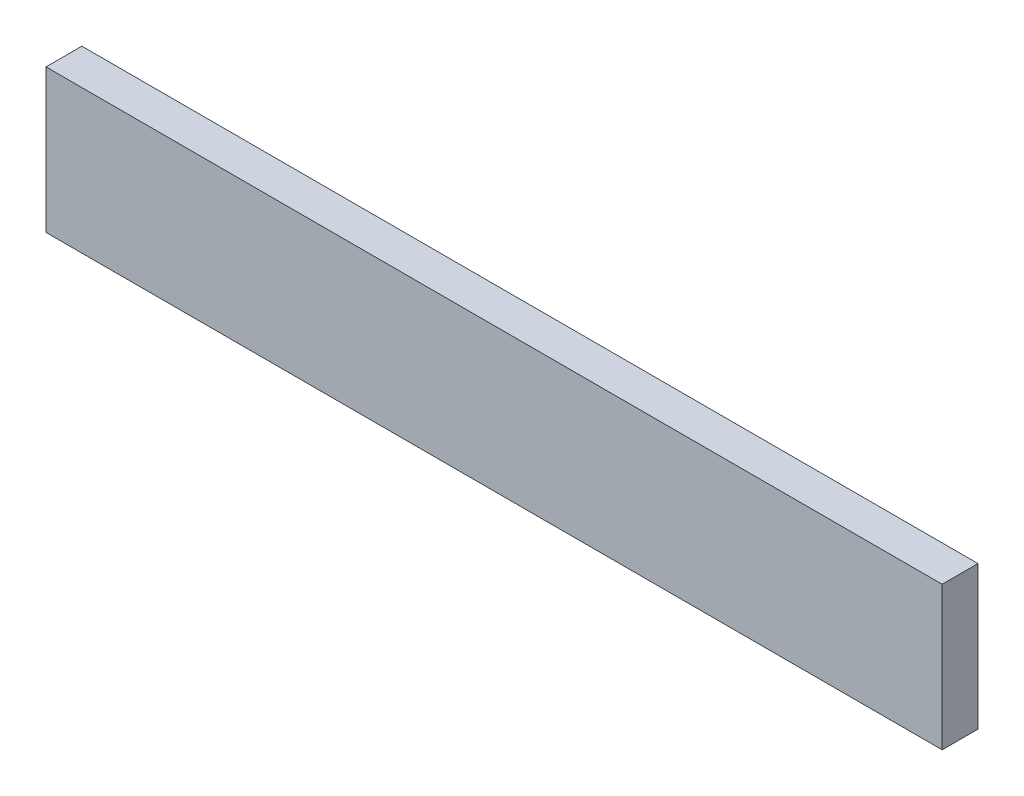
ISO-10303-21;
HEADER;
FILE_DESCRIPTION(('STEP AP214'),'2;1');
FILE_NAME('part.step','',(''),(''),'','','');
FILE_SCHEMA(('AUTOMOTIVE_DESIGN { 1 0 10303 214 1 1 1 1 }'));
ENDSEC;
DATA;
#1=APPLICATION_CONTEXT('core data for automotive mechanical design processes');
#2=APPLICATION_PROTOCOL_DEFINITION('international standard','automotive_design',2000,#1);
#3=PRODUCT_CONTEXT('',#1,'mechanical');
#4=PRODUCT('Part','Part','',(#3));
#5=PRODUCT_RELATED_PRODUCT_CATEGORY('part','',(#4));
#6=PRODUCT_DEFINITION_FORMATION('','',#4);
#7=PRODUCT_DEFINITION_CONTEXT('part definition',#1,'design');
#8=PRODUCT_DEFINITION('design','',#6,#7);
#9=PRODUCT_DEFINITION_SHAPE('','',#8);
#10=(LENGTH_UNIT() NAMED_UNIT(*) SI_UNIT(.MILLI.,.METRE.));
#11=(NAMED_UNIT(*) PLANE_ANGLE_UNIT() SI_UNIT($,.RADIAN.));
#12=(NAMED_UNIT(*) SI_UNIT($,.STERADIAN.) SOLID_ANGLE_UNIT());
#13=UNCERTAINTY_MEASURE_WITH_UNIT(LENGTH_MEASURE(1.E-05),#10,'distance_accuracy_value','');
#14=(GEOMETRIC_REPRESENTATION_CONTEXT(3) GLOBAL_UNCERTAINTY_ASSIGNED_CONTEXT((#13)) GLOBAL_UNIT_ASSIGNED_CONTEXT((#10,
#11,#12)) REPRESENTATION_CONTEXT('',''));
#15=CARTESIAN_POINT('',(0.,0.,0.));
#16=DIRECTION('',(0.,0.,1.));
#17=DIRECTION('',(1.,0.,0.));
#18=AXIS2_PLACEMENT_3D('',#15,#16,#17);
#19=CARTESIAN_POINT('',(0.,0.,2.));
#20=DIRECTION('',(1.,0.,0.));
#21=DIRECTION('',(0.,0.,-1.));
#22=AXIS2_PLACEMENT_3D('',#19,#20,#21);
#23=PLANE('',#22);
#24=DIRECTION('',(0.,-1.,0.));
#25=VECTOR('',#24,1.);
#26=CARTESIAN_POINT('',(0.,0.,0.));
#27=LINE('',#26,#25);
#28=CARTESIAN_POINT('',(0.,0.,0.));
#29=VERTEX_POINT('',#28);
#30=CARTESIAN_POINT('',(0.,-8.,0.));
#31=VERTEX_POINT('',#30);
#32=EDGE_CURVE('E96',#29,#31,#27,.T.);
#33=ORIENTED_EDGE('',*,*,#32,.T.);
#34=DIRECTION('',(0.,0.,-1.));
#35=VECTOR('',#34,1.);
#36=CARTESIAN_POINT('',(0.,-8.,2.));
#37=LINE('',#36,#35);
#38=CARTESIAN_POINT('',(0.,-8.,2.));
#39=VERTEX_POINT('',#38);
#40=EDGE_CURVE('E11',#39,#31,#37,.T.);
#41=ORIENTED_EDGE('',*,*,#40,.F.);
#42=DIRECTION('',(0.,-1.,0.));
#43=VECTOR('',#42,1.);
#44=CARTESIAN_POINT('',(0.,0.,2.));
#45=LINE('',#44,#43);
#46=CARTESIAN_POINT('',(0.,0.,2.));
#47=VERTEX_POINT('',#46);
#48=EDGE_CURVE('E84',#47,#39,#45,.T.);
#49=ORIENTED_EDGE('',*,*,#48,.F.);
#50=DIRECTION('',(0.,0.,-1.));
#51=VECTOR('',#50,1.);
#52=CARTESIAN_POINT('',(0.,0.,2.));
#53=LINE('',#52,#51);
#54=EDGE_CURVE('E92',#47,#29,#53,.T.);
#55=ORIENTED_EDGE('',*,*,#54,.T.);
#56=EDGE_LOOP('',(#33,#41,#49,#55));
#57=FACE_BOUND('',#56,.T.);
#58=ADVANCED_FACE('F33',(#57),#23,.F.);
#59=CARTESIAN_POINT('',(0.,-8.,2.));
#60=DIRECTION('',(0.,1.,0.));
#61=DIRECTION('',(0.,0.,1.));
#62=AXIS2_PLACEMENT_3D('',#59,#60,#61);
#63=PLANE('',#62);
#64=DIRECTION('',(1.,0.,0.));
#65=VECTOR('',#64,1.);
#66=CARTESIAN_POINT('',(0.,-8.,0.));
#67=LINE('',#66,#65);
#68=CARTESIAN_POINT('',(50.,-8.,0.));
#69=VERTEX_POINT('',#68);
#70=EDGE_CURVE('E88',#31,#69,#67,.T.);
#71=ORIENTED_EDGE('',*,*,#70,.T.);
#72=DIRECTION('',(0.,0.,-1.));
#73=VECTOR('',#72,1.);
#74=CARTESIAN_POINT('',(50.,-8.,2.));
#75=LINE('',#74,#73);
#76=CARTESIAN_POINT('',(50.,-8.,2.));
#77=VERTEX_POINT('',#76);
#78=EDGE_CURVE('E41',#77,#69,#75,.T.);
#79=ORIENTED_EDGE('',*,*,#78,.F.);
#80=DIRECTION('',(1.,0.,0.));
#81=VECTOR('',#80,1.);
#82=CARTESIAN_POINT('',(0.,-8.,2.));
#83=LINE('',#82,#81);
#84=EDGE_CURVE('E79',#39,#77,#83,.T.);
#85=ORIENTED_EDGE('',*,*,#84,.F.);
#86=ORIENTED_EDGE('',*,*,#40,.T.);
#87=EDGE_LOOP('',(#71,#79,#85,#86));
#88=FACE_BOUND('',#87,.T.);
#89=ADVANCED_FACE('F87',(#88),#63,.F.);
#90=CARTESIAN_POINT('',(50.,0.,2.));
#91=DIRECTION('',(-1.,0.,0.));
#92=DIRECTION('',(0.,0.,1.));
#93=AXIS2_PLACEMENT_3D('',#90,#91,#92);
#94=PLANE('',#93);
#95=DIRECTION('',(0.,1.,0.));
#96=VECTOR('',#95,1.);
#97=CARTESIAN_POINT('',(50.,0.,0.));
#98=LINE('',#97,#96);
#99=CARTESIAN_POINT('',(50.,0.,0.));
#100=VERTEX_POINT('',#99);
#101=EDGE_CURVE('E66',#69,#100,#98,.T.);
#102=ORIENTED_EDGE('',*,*,#101,.T.);
#103=DIRECTION('',(0.,0.,-1.));
#104=VECTOR('',#103,1.);
#105=CARTESIAN_POINT('',(50.,0.,2.));
#106=LINE('',#105,#104);
#107=CARTESIAN_POINT('',(50.,0.,2.));
#108=VERTEX_POINT('',#107);
#109=EDGE_CURVE('E89',#108,#100,#106,.T.);
#110=ORIENTED_EDGE('',*,*,#109,.F.);
#111=DIRECTION('',(0.,1.,0.));
#112=VECTOR('',#111,1.);
#113=CARTESIAN_POINT('',(50.,0.,2.));
#114=LINE('',#113,#112);
#115=EDGE_CURVE('E82',#77,#108,#114,.T.);
#116=ORIENTED_EDGE('',*,*,#115,.F.);
#117=ORIENTED_EDGE('',*,*,#78,.T.);
#118=EDGE_LOOP('',(#102,#110,#116,#117));
#119=FACE_BOUND('',#118,.T.);
#120=ADVANCED_FACE('F90',(#119),#94,.F.);
#121=CARTESIAN_POINT('',(0.,0.,2.));
#122=DIRECTION('',(0.,-1.,0.));
#123=DIRECTION('',(0.,0.,-1.));
#124=AXIS2_PLACEMENT_3D('',#121,#122,#123);
#125=PLANE('',#124);
#126=DIRECTION('',(-1.,0.,0.));
#127=VECTOR('',#126,1.);
#128=CARTESIAN_POINT('',(0.,0.,0.));
#129=LINE('',#128,#127);
#130=EDGE_CURVE('E72',#100,#29,#129,.T.);
#131=ORIENTED_EDGE('',*,*,#130,.T.);
#132=ORIENTED_EDGE('',*,*,#54,.F.);
#133=DIRECTION('',(-1.,0.,0.));
#134=VECTOR('',#133,1.);
#135=CARTESIAN_POINT('',(0.,0.,2.));
#136=LINE('',#135,#134);
#137=EDGE_CURVE('E49',#108,#47,#136,.T.);
#138=ORIENTED_EDGE('',*,*,#137,.F.);
#139=ORIENTED_EDGE('',*,*,#109,.T.);
#140=EDGE_LOOP('',(#131,#132,#138,#139));
#141=FACE_BOUND('',#140,.T.);
#142=ADVANCED_FACE('F103',(#141),#125,.F.);
#143=CARTESIAN_POINT('',(0.,0.,2.));
#144=DIRECTION('',(0.,0.,1.));
#145=DIRECTION('',(1.,0.,0.));
#146=AXIS2_PLACEMENT_3D('',#143,#144,#145);
#147=PLANE('',#146);
#148=ORIENTED_EDGE('',*,*,#48,.T.);
#149=ORIENTED_EDGE('',*,*,#84,.T.);
#150=ORIENTED_EDGE('',*,*,#115,.T.);
#151=ORIENTED_EDGE('',*,*,#137,.T.);
#152=EDGE_LOOP('',(#148,#149,#150,#151));
#153=FACE_BOUND('',#152,.T.);
#154=ADVANCED_FACE('F80',(#153),#147,.T.);
#155=CARTESIAN_POINT('',(0.,0.,0.));
#156=DIRECTION('',(0.,0.,1.));
#157=DIRECTION('',(1.,0.,0.));
#158=AXIS2_PLACEMENT_3D('',#155,#156,#157);
#159=PLANE('',#158);
#160=ORIENTED_EDGE('',*,*,#32,.F.);
#161=ORIENTED_EDGE('',*,*,#130,.F.);
#162=ORIENTED_EDGE('',*,*,#101,.F.);
#163=ORIENTED_EDGE('',*,*,#70,.F.);
#164=EDGE_LOOP('',(#160,#161,#162,#163));
#165=FACE_BOUND('',#164,.T.);
#166=ADVANCED_FACE('F106',(#165),#159,.F.);
#167=CLOSED_SHELL('',(#58,#89,#120,#142,#154,#166));
#168=MANIFOLD_SOLID_BREP('B2',#167);
#169=ADVANCED_BREP_SHAPE_REPRESENTATION('',(#18,#168),#14);
#170=SHAPE_DEFINITION_REPRESENTATION(#9,#169);
ENDSEC;
END-ISO-10303-21;
